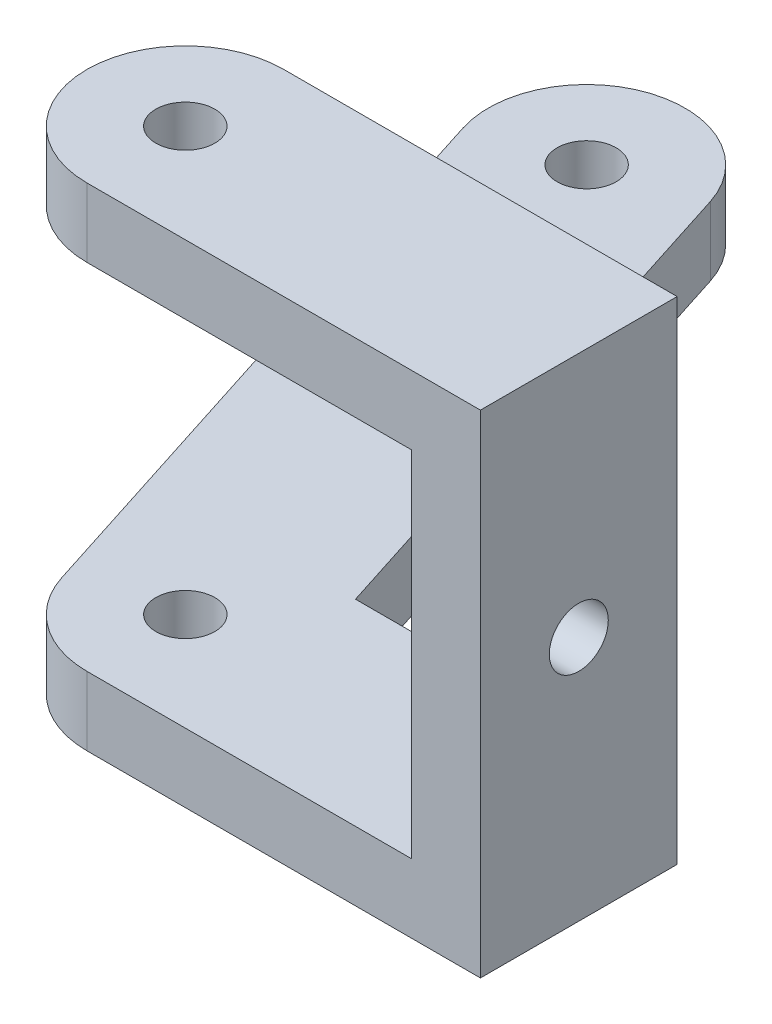
ISO-10303-21;
HEADER;
FILE_DESCRIPTION(('STEP AP214'),'2;1');
FILE_NAME('part.step','',(''),(''),'','','');
FILE_SCHEMA(('AUTOMOTIVE_DESIGN { 1 0 10303 214 1 1 1 1 }'));
ENDSEC;
DATA;
#1=APPLICATION_CONTEXT('core data for automotive mechanical design processes');
#2=APPLICATION_PROTOCOL_DEFINITION('international standard','automotive_design',2000,#1);
#3=PRODUCT_CONTEXT('',#1,'mechanical');
#4=PRODUCT('Part','Part','',(#3));
#5=PRODUCT_RELATED_PRODUCT_CATEGORY('part','',(#4));
#6=PRODUCT_DEFINITION_FORMATION('','',#4);
#7=PRODUCT_DEFINITION_CONTEXT('part definition',#1,'design');
#8=PRODUCT_DEFINITION('design','',#6,#7);
#9=PRODUCT_DEFINITION_SHAPE('','',#8);
#10=(LENGTH_UNIT() NAMED_UNIT(*) SI_UNIT(.MILLI.,.METRE.));
#11=(NAMED_UNIT(*) PLANE_ANGLE_UNIT() SI_UNIT($,.RADIAN.));
#12=(NAMED_UNIT(*) SI_UNIT($,.STERADIAN.) SOLID_ANGLE_UNIT());
#13=UNCERTAINTY_MEASURE_WITH_UNIT(LENGTH_MEASURE(1.E-05),#10,'distance_accuracy_value','');
#14=(GEOMETRIC_REPRESENTATION_CONTEXT(3) GLOBAL_UNCERTAINTY_ASSIGNED_CONTEXT((#13)) GLOBAL_UNIT_ASSIGNED_CONTEXT((#10,
#11,#12)) REPRESENTATION_CONTEXT('',''));
#15=CARTESIAN_POINT('',(0.,0.,0.));
#16=DIRECTION('',(0.,0.,1.));
#17=DIRECTION('',(1.,0.,0.));
#18=AXIS2_PLACEMENT_3D('',#15,#16,#17);
#19=CARTESIAN_POINT('',(79.9999999999999,9.,125.));
#20=DIRECTION('',(0.,1.,0.));
#21=DIRECTION('',(0.,0.,1.));
#22=AXIS2_PLACEMENT_3D('',#19,#20,#21);
#23=CYLINDRICAL_SURFACE('',#22,5.);
#24=CARTESIAN_POINT('',(79.9999999999999,12.5,125.));
#25=DIRECTION('',(0.,1.,0.));
#26=DIRECTION('',(0.,0.,1.));
#27=AXIS2_PLACEMENT_3D('',#24,#25,#26);
#28=CIRCLE('',#27,5.);
#29=CARTESIAN_POINT('',(79.9999999999999,12.5,120.));
#30=VERTEX_POINT('',#29);
#31=CARTESIAN_POINT('',(79.9999999999999,12.5,130.));
#32=VERTEX_POINT('',#31);
#33=EDGE_CURVE('E201',#30,#32,#28,.T.);
#34=ORIENTED_EDGE('',*,*,#33,.F.);
#35=DIRECTION('',(0.,1.,0.));
#36=VECTOR('',#35,1.);
#37=CARTESIAN_POINT('',(79.9999999999999,9.,120.));
#38=LINE('',#37,#36);
#39=CARTESIAN_POINT('',(79.9999999999999,9.,120.));
#40=VERTEX_POINT('',#39);
#41=EDGE_CURVE('E11',#40,#30,#38,.T.);
#42=ORIENTED_EDGE('',*,*,#41,.F.);
#43=CARTESIAN_POINT('',(79.9999999999999,9.,125.));
#44=DIRECTION('',(0.,1.,0.));
#45=DIRECTION('',(0.,0.,1.));
#46=AXIS2_PLACEMENT_3D('',#43,#44,#45);
#47=CIRCLE('',#46,5.);
#48=CARTESIAN_POINT('',(79.9999999999999,9.,130.));
#49=VERTEX_POINT('',#48);
#50=EDGE_CURVE('E204',#40,#49,#47,.T.);
#51=ORIENTED_EDGE('',*,*,#50,.T.);
#52=DIRECTION('',(0.,1.,0.));
#53=VECTOR('',#52,1.);
#54=CARTESIAN_POINT('',(79.9999999999999,9.,130.));
#55=LINE('',#54,#53);
#56=EDGE_CURVE('E213',#49,#32,#55,.T.);
#57=ORIENTED_EDGE('',*,*,#56,.T.);
#58=EDGE_LOOP('',(#34,#42,#51,#57));
#59=FACE_BOUND('',#58,.T.);
#60=ADVANCED_FACE('F42',(#59),#23,.T.);
#61=CARTESIAN_POINT('',(79.9999999999999,9.,120.));
#62=DIRECTION('',(0.,0.,-1.));
#63=DIRECTION('',(-1.,0.,0.));
#64=AXIS2_PLACEMENT_3D('',#61,#62,#63);
#65=PLANE('',#64);
#66=DIRECTION('',(0.,-1.,0.));
#67=VECTOR('',#66,1.);
#68=CARTESIAN_POINT('',(83.6497618993626,9.,120.));
#69=LINE('',#68,#67);
#70=CARTESIAN_POINT('',(83.6497618993626,-9.,120.));
#71=VERTEX_POINT('',#70);
#72=CARTESIAN_POINT('',(83.6497618993626,-12.5,120.));
#73=VERTEX_POINT('',#72);
#74=EDGE_CURVE('E66',#71,#73,#69,.T.);
#75=ORIENTED_EDGE('',*,*,#74,.F.);
#76=DIRECTION('',(-1.,0.,0.));
#77=VECTOR('',#76,1.);
#78=CARTESIAN_POINT('',(79.9999999999999,-9.,120.));
#79=LINE('',#78,#77);
#80=CARTESIAN_POINT('',(96.4999999999999,-9.,120.));
#81=VERTEX_POINT('',#80);
#82=EDGE_CURVE('E176',#81,#71,#79,.T.);
#83=ORIENTED_EDGE('',*,*,#82,.F.);
#84=DIRECTION('',(0.,-1.,0.));
#85=VECTOR('',#84,1.);
#86=CARTESIAN_POINT('',(96.4999999999999,19.5948100502086,120.));
#87=LINE('',#86,#85);
#88=CARTESIAN_POINT('',(96.4999999999999,9.,120.));
#89=VERTEX_POINT('',#88);
#90=EDGE_CURVE('E185',#89,#81,#87,.T.);
#91=ORIENTED_EDGE('',*,*,#90,.F.);
#92=DIRECTION('',(-1.,0.,0.));
#93=VECTOR('',#92,1.);
#94=CARTESIAN_POINT('',(79.9999999999999,9.,120.));
#95=LINE('',#94,#93);
#96=EDGE_CURVE('E211',#89,#40,#95,.T.);
#97=ORIENTED_EDGE('',*,*,#96,.T.);
#98=ORIENTED_EDGE('',*,*,#41,.T.);
#99=DIRECTION('',(-1.,0.,0.));
#100=VECTOR('',#99,1.);
#101=CARTESIAN_POINT('',(79.9999999999999,12.5,120.));
#102=LINE('',#101,#100);
#103=CARTESIAN_POINT('',(99.9999999999999,12.5,120.));
#104=VERTEX_POINT('',#103);
#105=EDGE_CURVE('E208',#104,#30,#102,.T.);
#106=ORIENTED_EDGE('',*,*,#105,.F.);
#107=DIRECTION('',(0.,1.,0.));
#108=VECTOR('',#107,1.);
#109=CARTESIAN_POINT('',(99.9999999999999,9.,120.));
#110=LINE('',#109,#108);
#111=CARTESIAN_POINT('',(99.9999999999999,-12.5,120.));
#112=VERTEX_POINT('',#111);
#113=EDGE_CURVE('E50',#112,#104,#110,.T.);
#114=ORIENTED_EDGE('',*,*,#113,.F.);
#115=DIRECTION('',(-1.,0.,0.));
#116=VECTOR('',#115,1.);
#117=CARTESIAN_POINT('',(79.9999999999999,-12.5,120.));
#118=LINE('',#117,#116);
#119=EDGE_CURVE('E174',#112,#73,#118,.T.);
#120=ORIENTED_EDGE('',*,*,#119,.T.);
#121=EDGE_LOOP('',(#75,#83,#91,#97,#98,#106,#114,#120));
#122=FACE_BOUND('',#121,.T.);
#123=ADVANCED_FACE('F238',(#122),#65,.T.);
#124=CARTESIAN_POINT('',(99.9999999999999,9.,120.));
#125=DIRECTION('',(1.,0.,0.));
#126=DIRECTION('',(0.,0.,-1.));
#127=AXIS2_PLACEMENT_3D('',#124,#125,#126);
#128=PLANE('',#127);
#129=CARTESIAN_POINT('',(99.9999999999999,0.,125.));
#130=DIRECTION('',(1.,0.,0.));
#131=DIRECTION('',(0.,0.,-1.));
#132=AXIS2_PLACEMENT_3D('',#129,#130,#131);
#133=CIRCLE('',#132,1.5);
#134=CARTESIAN_POINT('',(99.9999999999999,0.,123.5));
#135=VERTEX_POINT('',#134);
#136=EDGE_CURVE('E164',#135,#135,#133,.T.);
#137=ORIENTED_EDGE('',*,*,#136,.F.);
#138=EDGE_LOOP('',(#137));
#139=FACE_BOUND('',#138,.T.);
#140=DIRECTION('',(0.,0.,-1.));
#141=VECTOR('',#140,1.);
#142=CARTESIAN_POINT('',(99.9999999999999,12.5,120.));
#143=LINE('',#142,#141);
#144=CARTESIAN_POINT('',(99.9999999999999,12.5,130.));
#145=VERTEX_POINT('',#144);
#146=EDGE_CURVE('E219',#145,#104,#143,.T.);
#147=ORIENTED_EDGE('',*,*,#146,.F.);
#148=DIRECTION('',(0.,1.,0.));
#149=VECTOR('',#148,1.);
#150=CARTESIAN_POINT('',(99.9999999999999,9.,130.));
#151=LINE('',#150,#149);
#152=CARTESIAN_POINT('',(99.9999999999999,-12.5,130.));
#153=VERTEX_POINT('',#152);
#154=EDGE_CURVE('E225',#153,#145,#151,.T.);
#155=ORIENTED_EDGE('',*,*,#154,.F.);
#156=DIRECTION('',(0.,0.,-1.));
#157=VECTOR('',#156,1.);
#158=CARTESIAN_POINT('',(99.9999999999999,-12.5,120.));
#159=LINE('',#158,#157);
#160=EDGE_CURVE('E180',#153,#112,#159,.T.);
#161=ORIENTED_EDGE('',*,*,#160,.T.);
#162=ORIENTED_EDGE('',*,*,#113,.T.);
#163=EDGE_LOOP('',(#147,#155,#161,#162));
#164=FACE_BOUND('',#163,.T.);
#165=ADVANCED_FACE('F282',(#139,#164),#128,.T.);
#166=CARTESIAN_POINT('',(99.9999999999999,9.,130.));
#167=DIRECTION('',(0.,0.,1.));
#168=DIRECTION('',(1.,0.,0.));
#169=AXIS2_PLACEMENT_3D('',#166,#167,#168);
#170=PLANE('',#169);
#171=DIRECTION('',(1.,0.,0.));
#172=VECTOR('',#171,1.);
#173=CARTESIAN_POINT('',(99.9999999999999,12.5,130.));
#174=LINE('',#173,#172);
#175=EDGE_CURVE('E216',#32,#145,#174,.T.);
#176=ORIENTED_EDGE('',*,*,#175,.F.);
#177=ORIENTED_EDGE('',*,*,#56,.F.);
#178=DIRECTION('',(1.,0.,0.));
#179=VECTOR('',#178,1.);
#180=CARTESIAN_POINT('',(99.9999999999999,9.,130.));
#181=LINE('',#180,#179);
#182=CARTESIAN_POINT('',(96.4999999999999,9.,130.));
#183=VERTEX_POINT('',#182);
#184=EDGE_CURVE('E207',#49,#183,#181,.T.);
#185=ORIENTED_EDGE('',*,*,#184,.T.);
#186=DIRECTION('',(0.,-1.,0.));
#187=VECTOR('',#186,1.);
#188=CARTESIAN_POINT('',(96.4999999999999,19.5948100502086,130.));
#189=LINE('',#188,#187);
#190=CARTESIAN_POINT('',(96.4999999999999,-9.,130.));
#191=VERTEX_POINT('',#190);
#192=EDGE_CURVE('E189',#183,#191,#189,.T.);
#193=ORIENTED_EDGE('',*,*,#192,.T.);
#194=DIRECTION('',(1.,0.,0.));
#195=VECTOR('',#194,1.);
#196=CARTESIAN_POINT('',(99.9999999999999,-9.,130.));
#197=LINE('',#196,#195);
#198=CARTESIAN_POINT('',(79.9999999999999,-9.,130.));
#199=VERTEX_POINT('',#198);
#200=EDGE_CURVE('E173',#199,#191,#197,.T.);
#201=ORIENTED_EDGE('',*,*,#200,.F.);
#202=DIRECTION('',(0.,-1.,0.));
#203=VECTOR('',#202,1.);
#204=CARTESIAN_POINT('',(79.9999999999999,-9.,130.));
#205=LINE('',#204,#203);
#206=CARTESIAN_POINT('',(79.9999999999999,-12.5,130.));
#207=VERTEX_POINT('',#206);
#208=EDGE_CURVE('E177',#199,#207,#205,.T.);
#209=ORIENTED_EDGE('',*,*,#208,.T.);
#210=DIRECTION('',(1.,0.,0.));
#211=VECTOR('',#210,1.);
#212=CARTESIAN_POINT('',(99.9999999999999,-12.5,130.));
#213=LINE('',#212,#211);
#214=EDGE_CURVE('E136',#207,#153,#213,.T.);
#215=ORIENTED_EDGE('',*,*,#214,.T.);
#216=ORIENTED_EDGE('',*,*,#154,.T.);
#217=EDGE_LOOP('',(#176,#177,#185,#193,#201,#209,#215,#216));
#218=FACE_BOUND('',#217,.T.);
#219=ADVANCED_FACE('F233',(#218),#170,.T.);
#220=CARTESIAN_POINT('',(79.9999999999999,9.,125.));
#221=DIRECTION('',(0.,1.,0.));
#222=DIRECTION('',(0.,0.,1.));
#223=AXIS2_PLACEMENT_3D('',#220,#221,#222);
#224=PLANE('',#223);
#225=CARTESIAN_POINT('',(79.9999999999999,9.,125.));
#226=DIRECTION('',(0.,1.,0.));
#227=DIRECTION('',(0.,0.,1.));
#228=AXIS2_PLACEMENT_3D('',#225,#226,#227);
#229=CIRCLE('',#228,1.5);
#230=CARTESIAN_POINT('',(79.9999999999999,9.,126.5));
#231=VERTEX_POINT('',#230);
#232=EDGE_CURVE('E198',#231,#231,#229,.T.);
#233=ORIENTED_EDGE('',*,*,#232,.T.);
#234=EDGE_LOOP('',(#233));
#235=FACE_BOUND('',#234,.T.);
#236=ORIENTED_EDGE('',*,*,#96,.F.);
#237=DIRECTION('',(0.,0.,1.));
#238=VECTOR('',#237,1.);
#239=CARTESIAN_POINT('',(96.4999999999999,9.,120.));
#240=LINE('',#239,#238);
#241=EDGE_CURVE('E190',#89,#183,#240,.T.);
#242=ORIENTED_EDGE('',*,*,#241,.T.);
#243=ORIENTED_EDGE('',*,*,#184,.F.);
#244=ORIENTED_EDGE('',*,*,#50,.F.);
#245=EDGE_LOOP('',(#236,#242,#243,#244));
#246=FACE_BOUND('',#245,.T.);
#247=ADVANCED_FACE('F242',(#235,#246),#224,.F.);
#248=CARTESIAN_POINT('',(79.9999999999999,12.5,125.));
#249=DIRECTION('',(0.,1.,0.));
#250=DIRECTION('',(0.,0.,1.));
#251=AXIS2_PLACEMENT_3D('',#248,#249,#250);
#252=PLANE('',#251);
#253=CARTESIAN_POINT('',(79.9999999999999,12.5,125.));
#254=DIRECTION('',(0.,1.,0.));
#255=DIRECTION('',(0.,0.,1.));
#256=AXIS2_PLACEMENT_3D('',#253,#254,#255);
#257=CIRCLE('',#256,1.5);
#258=CARTESIAN_POINT('',(79.9999999999999,12.5,126.5));
#259=VERTEX_POINT('',#258);
#260=EDGE_CURVE('E193',#259,#259,#257,.T.);
#261=ORIENTED_EDGE('',*,*,#260,.F.);
#262=EDGE_LOOP('',(#261));
#263=FACE_BOUND('',#262,.T.);
#264=ORIENTED_EDGE('',*,*,#33,.T.);
#265=ORIENTED_EDGE('',*,*,#175,.T.);
#266=ORIENTED_EDGE('',*,*,#146,.T.);
#267=ORIENTED_EDGE('',*,*,#105,.T.);
#268=EDGE_LOOP('',(#264,#265,#266,#267));
#269=FACE_BOUND('',#268,.T.);
#270=ADVANCED_FACE('F236',(#263,#269),#252,.T.);
#271=CARTESIAN_POINT('',(79.9999999999999,9.,125.));
#272=DIRECTION('',(0.,1.,0.));
#273=DIRECTION('',(0.,0.,1.));
#274=AXIS2_PLACEMENT_3D('',#271,#272,#273);
#275=CYLINDRICAL_SURFACE('',#274,1.5);
#276=ORIENTED_EDGE('',*,*,#232,.F.);
#277=EDGE_LOOP('',(#276));
#278=FACE_BOUND('',#277,.T.);
#279=ORIENTED_EDGE('',*,*,#260,.T.);
#280=EDGE_LOOP('',(#279));
#281=FACE_BOUND('',#280,.T.);
#282=ADVANCED_FACE('F303',(#278,#281),#275,.F.);
#283=CARTESIAN_POINT('',(96.4999999999999,19.5948100502086,120.));
#284=DIRECTION('',(1.,0.,0.));
#285=DIRECTION('',(0.,0.,-1.));
#286=AXIS2_PLACEMENT_3D('',#283,#284,#285);
#287=PLANE('',#286);
#288=CARTESIAN_POINT('',(96.4999999999999,0.,125.));
#289=DIRECTION('',(1.,0.,0.));
#290=DIRECTION('',(0.,0.,-1.));
#291=AXIS2_PLACEMENT_3D('',#288,#289,#290);
#292=CIRCLE('',#291,1.5);
#293=CARTESIAN_POINT('',(96.4999999999999,0.,123.5));
#294=VERTEX_POINT('',#293);
#295=EDGE_CURVE('E45',#294,#294,#292,.T.);
#296=ORIENTED_EDGE('',*,*,#295,.T.);
#297=EDGE_LOOP('',(#296));
#298=FACE_BOUND('',#297,.T.);
#299=ORIENTED_EDGE('',*,*,#241,.F.);
#300=ORIENTED_EDGE('',*,*,#90,.T.);
#301=DIRECTION('',(0.,0.,1.));
#302=VECTOR('',#301,1.);
#303=CARTESIAN_POINT('',(96.4999999999999,-9.,120.));
#304=LINE('',#303,#302);
#305=EDGE_CURVE('E186',#81,#191,#304,.T.);
#306=ORIENTED_EDGE('',*,*,#305,.T.);
#307=ORIENTED_EDGE('',*,*,#192,.F.);
#308=EDGE_LOOP('',(#299,#300,#306,#307));
#309=FACE_BOUND('',#308,.T.);
#310=ADVANCED_FACE('F245',(#298,#309),#287,.F.);
#311=CARTESIAN_POINT('',(79.9999999999999,-9.,125.));
#312=DIRECTION('',(0.,-1.,0.));
#313=DIRECTION('',(0.,0.,1.));
#314=AXIS2_PLACEMENT_3D('',#311,#312,#313);
#315=CYLINDRICAL_SURFACE('',#314,5.);
#316=DIRECTION('',(0.,1.,0.));
#317=VECTOR('',#316,1.);
#318=CARTESIAN_POINT('',(75.2378792640033,-57.0439109194512,126.523878635519));
#319=LINE('',#318,#317);
#320=CARTESIAN_POINT('',(75.2378792640033,-12.5,126.523878635519));
#321=VERTEX_POINT('',#320);
#322=CARTESIAN_POINT('',(75.2378792640033,-9.,126.523878635519));
#323=VERTEX_POINT('',#322);
#324=EDGE_CURVE('E140',#321,#323,#319,.T.);
#325=ORIENTED_EDGE('',*,*,#324,.F.);
#326=CARTESIAN_POINT('',(79.9999999999999,-12.5,125.));
#327=DIRECTION('',(0.,1.,0.));
#328=DIRECTION('',(0.,0.,1.));
#329=AXIS2_PLACEMENT_3D('',#326,#327,#328);
#330=CIRCLE('',#329,5.);
#331=EDGE_CURVE('E126',#321,#207,#330,.T.);
#332=ORIENTED_EDGE('',*,*,#331,.T.);
#333=ORIENTED_EDGE('',*,*,#208,.F.);
#334=CARTESIAN_POINT('',(79.9999999999999,-9.,125.));
#335=DIRECTION('',(0.,1.,0.));
#336=DIRECTION('',(0.,0.,1.));
#337=AXIS2_PLACEMENT_3D('',#334,#335,#336);
#338=CIRCLE('',#337,5.);
#339=EDGE_CURVE('E58',#323,#199,#338,.T.);
#340=ORIENTED_EDGE('',*,*,#339,.F.);
#341=EDGE_LOOP('',(#325,#332,#333,#340));
#342=FACE_BOUND('',#341,.T.);
#343=ADVANCED_FACE('F141',(#342),#315,.T.);
#344=CARTESIAN_POINT('',(79.9999999999999,-9.,125.));
#345=DIRECTION('',(0.,-1.,0.));
#346=DIRECTION('',(0.,0.,1.));
#347=AXIS2_PLACEMENT_3D('',#344,#345,#346);
#348=PLANE('',#347);
#349=ORIENTED_EDGE('',*,*,#82,.T.);
#350=DIRECTION('',(-0.304775727103784,0.,-0.952424147199324));
#351=VECTOR('',#350,1.);
#352=CARTESIAN_POINT('',(75.1621207359965,-9.,93.4761213644811));
#353=LINE('',#352,#351);
#354=CARTESIAN_POINT('',(75.1621207359965,-9.,93.4761213644811));
#355=VERTEX_POINT('',#354);
#356=EDGE_CURVE('E254',#71,#355,#353,.T.);
#357=ORIENTED_EDGE('',*,*,#356,.T.);
#358=CARTESIAN_POINT('',(70.3999999999999,-9.,95.));
#359=DIRECTION('',(0.,1.,0.));
#360=DIRECTION('',(0.,0.,1.));
#361=AXIS2_PLACEMENT_3D('',#358,#359,#360);
#362=CIRCLE('',#361,4.99999999999999);
#363=CARTESIAN_POINT('',(65.6378792640033,-9.,96.5238786355189));
#364=VERTEX_POINT('',#363);
#365=EDGE_CURVE('E253',#355,#364,#362,.T.);
#366=ORIENTED_EDGE('',*,*,#365,.T.);
#367=DIRECTION('',(0.304775727103784,0.,0.952424147199324));
#368=VECTOR('',#367,1.);
#369=CARTESIAN_POINT('',(65.6378792640033,-9.,96.5238786355189));
#370=LINE('',#369,#368);
#371=EDGE_CURVE('E251',#364,#323,#370,.T.);
#372=ORIENTED_EDGE('',*,*,#371,.T.);
#373=ORIENTED_EDGE('',*,*,#339,.T.);
#374=ORIENTED_EDGE('',*,*,#200,.T.);
#375=ORIENTED_EDGE('',*,*,#305,.F.);
#376=EDGE_LOOP('',(#349,#357,#366,#372,#373,#374,#375));
#377=FACE_BOUND('',#376,.T.);
#378=CARTESIAN_POINT('',(79.9999999999999,-9.,125.));
#379=DIRECTION('',(0.,1.,0.));
#380=DIRECTION('',(0.,0.,1.));
#381=AXIS2_PLACEMENT_3D('',#378,#379,#380);
#382=CIRCLE('',#381,1.5);
#383=CARTESIAN_POINT('',(79.9999999999999,-9.,126.5));
#384=VERTEX_POINT('',#383);
#385=EDGE_CURVE('E138',#384,#384,#382,.T.);
#386=ORIENTED_EDGE('',*,*,#385,.F.);
#387=EDGE_LOOP('',(#386));
#388=FACE_BOUND('',#387,.T.);
#389=CARTESIAN_POINT('',(70.3999999999999,-9.,95.));
#390=DIRECTION('',(0.,1.,0.));
#391=DIRECTION('',(0.,0.,1.));
#392=AXIS2_PLACEMENT_3D('',#389,#390,#391);
#393=CIRCLE('',#392,1.5);
#394=CARTESIAN_POINT('',(70.3999999999999,-9.,96.5));
#395=VERTEX_POINT('',#394);
#396=EDGE_CURVE('E145',#395,#395,#393,.T.);
#397=ORIENTED_EDGE('',*,*,#396,.F.);
#398=EDGE_LOOP('',(#397));
#399=FACE_BOUND('',#398,.T.);
#400=ADVANCED_FACE('F247',(#377,#388,#399),#348,.F.);
#401=CARTESIAN_POINT('',(79.9999999999999,-12.5,125.));
#402=DIRECTION('',(0.,-1.,0.));
#403=DIRECTION('',(0.,0.,1.));
#404=AXIS2_PLACEMENT_3D('',#401,#402,#403);
#405=PLANE('',#404);
#406=DIRECTION('',(-0.304775727103784,0.,-0.952424147199324));
#407=VECTOR('',#406,1.);
#408=CARTESIAN_POINT('',(75.1621207359965,-12.5,93.4761213644811));
#409=LINE('',#408,#407);
#410=CARTESIAN_POINT('',(75.1621207359965,-12.5,93.4761213644811));
#411=VERTEX_POINT('',#410);
#412=EDGE_CURVE('E153',#73,#411,#409,.T.);
#413=ORIENTED_EDGE('',*,*,#412,.F.);
#414=ORIENTED_EDGE('',*,*,#119,.F.);
#415=ORIENTED_EDGE('',*,*,#160,.F.);
#416=ORIENTED_EDGE('',*,*,#214,.F.);
#417=ORIENTED_EDGE('',*,*,#331,.F.);
#418=DIRECTION('',(0.304775727103784,0.,0.952424147199324));
#419=VECTOR('',#418,1.);
#420=CARTESIAN_POINT('',(65.6378792640033,-12.5,96.5238786355189));
#421=LINE('',#420,#419);
#422=CARTESIAN_POINT('',(65.6378792640033,-12.5,96.5238786355189));
#423=VERTEX_POINT('',#422);
#424=EDGE_CURVE('E132',#423,#321,#421,.T.);
#425=ORIENTED_EDGE('',*,*,#424,.F.);
#426=CARTESIAN_POINT('',(70.3999999999999,-12.5,95.));
#427=DIRECTION('',(0.,-1.,0.));
#428=DIRECTION('',(0.,0.,-1.));
#429=AXIS2_PLACEMENT_3D('',#426,#427,#428);
#430=CIRCLE('',#429,4.99999999999999);
#431=EDGE_CURVE('E159',#411,#423,#430,.F.);
#432=ORIENTED_EDGE('',*,*,#431,.F.);
#433=EDGE_LOOP('',(#413,#414,#415,#416,#417,#425,#432));
#434=FACE_BOUND('',#433,.T.);
#435=CARTESIAN_POINT('',(79.9999999999999,-12.5,125.));
#436=DIRECTION('',(0.,1.,0.));
#437=DIRECTION('',(0.,0.,1.));
#438=AXIS2_PLACEMENT_3D('',#435,#436,#437);
#439=CIRCLE('',#438,1.5);
#440=CARTESIAN_POINT('',(79.9999999999999,-12.5,126.5));
#441=VERTEX_POINT('',#440);
#442=EDGE_CURVE('E167',#441,#441,#439,.T.);
#443=ORIENTED_EDGE('',*,*,#442,.T.);
#444=EDGE_LOOP('',(#443));
#445=FACE_BOUND('',#444,.T.);
#446=CARTESIAN_POINT('',(70.3999999999999,-12.5,95.));
#447=DIRECTION('',(0.,-1.,0.));
#448=DIRECTION('',(0.,0.,-1.));
#449=AXIS2_PLACEMENT_3D('',#446,#447,#448);
#450=CIRCLE('',#449,1.5);
#451=CARTESIAN_POINT('',(70.3999999999999,-12.5,93.5));
#452=VERTEX_POINT('',#451);
#453=EDGE_CURVE('E157',#452,#452,#450,.F.);
#454=ORIENTED_EDGE('',*,*,#453,.T.);
#455=EDGE_LOOP('',(#454));
#456=FACE_BOUND('',#455,.T.);
#457=ADVANCED_FACE('F128',(#434,#445,#456),#405,.T.);
#458=CARTESIAN_POINT('',(79.9999999999999,-9.,125.));
#459=DIRECTION('',(0.,-1.,0.));
#460=DIRECTION('',(0.,0.,1.));
#461=AXIS2_PLACEMENT_3D('',#458,#459,#460);
#462=CYLINDRICAL_SURFACE('',#461,1.5);
#463=ORIENTED_EDGE('',*,*,#385,.T.);
#464=EDGE_LOOP('',(#463));
#465=FACE_BOUND('',#464,.T.);
#466=ORIENTED_EDGE('',*,*,#442,.F.);
#467=EDGE_LOOP('',(#466));
#468=FACE_BOUND('',#467,.T.);
#469=ADVANCED_FACE('F271',(#465,#468),#462,.F.);
#470=CARTESIAN_POINT('',(-100.,0.,125.));
#471=DIRECTION('',(1.,0.,0.));
#472=DIRECTION('',(0.,0.,-1.));
#473=AXIS2_PLACEMENT_3D('',#470,#471,#472);
#474=CYLINDRICAL_SURFACE('',#473,1.5);
#475=ORIENTED_EDGE('',*,*,#136,.T.);
#476=EDGE_LOOP('',(#475));
#477=FACE_BOUND('',#476,.T.);
#478=ORIENTED_EDGE('',*,*,#295,.F.);
#479=EDGE_LOOP('',(#478));
#480=FACE_BOUND('',#479,.T.);
#481=ADVANCED_FACE('F317',(#477,#480),#474,.F.);
#482=CARTESIAN_POINT('',(70.3999999999999,-57.0439109194512,95.));
#483=DIRECTION('',(0.,1.,0.));
#484=DIRECTION('',(0.,0.,1.));
#485=AXIS2_PLACEMENT_3D('',#482,#483,#484);
#486=CYLINDRICAL_SURFACE('',#485,4.99999999999999);
#487=DIRECTION('',(0.,1.,0.));
#488=VECTOR('',#487,1.);
#489=CARTESIAN_POINT('',(75.1621207359965,-57.0439109194512,93.4761213644811));
#490=LINE('',#489,#488);
#491=EDGE_CURVE('E150',#411,#355,#490,.T.);
#492=ORIENTED_EDGE('',*,*,#491,.F.);
#493=ORIENTED_EDGE('',*,*,#431,.T.);
#494=DIRECTION('',(0.,1.,0.));
#495=VECTOR('',#494,1.);
#496=CARTESIAN_POINT('',(65.6378792640033,-57.0439109194512,96.5238786355189));
#497=LINE('',#496,#495);
#498=EDGE_CURVE('E149',#423,#364,#497,.T.);
#499=ORIENTED_EDGE('',*,*,#498,.T.);
#500=ORIENTED_EDGE('',*,*,#365,.F.);
#501=EDGE_LOOP('',(#492,#493,#499,#500));
#502=FACE_BOUND('',#501,.T.);
#503=ADVANCED_FACE('F319',(#502),#486,.T.);
#504=CARTESIAN_POINT('',(75.1621207359965,-57.0439109194512,93.4761213644811));
#505=DIRECTION('',(0.952424147199324,0.,-0.304775727103784));
#506=DIRECTION('',(-0.304775727103784,0.,-0.952424147199324));
#507=AXIS2_PLACEMENT_3D('',#504,#505,#506);
#508=PLANE('',#507);
#509=ORIENTED_EDGE('',*,*,#356,.F.);
#510=ORIENTED_EDGE('',*,*,#74,.T.);
#511=ORIENTED_EDGE('',*,*,#412,.T.);
#512=ORIENTED_EDGE('',*,*,#491,.T.);
#513=EDGE_LOOP('',(#509,#510,#511,#512));
#514=FACE_BOUND('',#513,.T.);
#515=ADVANCED_FACE('F327',(#514),#508,.T.);
#516=CARTESIAN_POINT('',(65.6378792640033,-57.0439109194512,96.5238786355189));
#517=DIRECTION('',(-0.952424147199324,0.,0.304775727103784));
#518=DIRECTION('',(0.304775727103784,0.,0.952424147199324));
#519=AXIS2_PLACEMENT_3D('',#516,#517,#518);
#520=PLANE('',#519);
#521=ORIENTED_EDGE('',*,*,#498,.F.);
#522=ORIENTED_EDGE('',*,*,#424,.T.);
#523=ORIENTED_EDGE('',*,*,#324,.T.);
#524=ORIENTED_EDGE('',*,*,#371,.F.);
#525=EDGE_LOOP('',(#521,#522,#523,#524));
#526=FACE_BOUND('',#525,.T.);
#527=ADVANCED_FACE('F148',(#526),#520,.T.);
#528=CARTESIAN_POINT('',(70.3999999999999,-57.0439109194512,95.));
#529=DIRECTION('',(0.,1.,0.));
#530=DIRECTION('',(0.,0.,1.));
#531=AXIS2_PLACEMENT_3D('',#528,#529,#530);
#532=CYLINDRICAL_SURFACE('',#531,1.5);
#533=ORIENTED_EDGE('',*,*,#396,.T.);
#534=EDGE_LOOP('',(#533));
#535=FACE_BOUND('',#534,.T.);
#536=ORIENTED_EDGE('',*,*,#453,.F.);
#537=EDGE_LOOP('',(#536));
#538=FACE_BOUND('',#537,.T.);
#539=ADVANCED_FACE('F261',(#535,#538),#532,.F.);
#540=CLOSED_SHELL('',(#60,#123,#165,#219,#247,#270,#282,#310,#343,#400,#457,#469,#481,#503,#515,
#527,#539));
#541=MANIFOLD_SOLID_BREP('B2',#540);
#542=ADVANCED_BREP_SHAPE_REPRESENTATION('',(#18,#541),#14);
#543=SHAPE_DEFINITION_REPRESENTATION(#9,#542);
ENDSEC;
END-ISO-10303-21;
